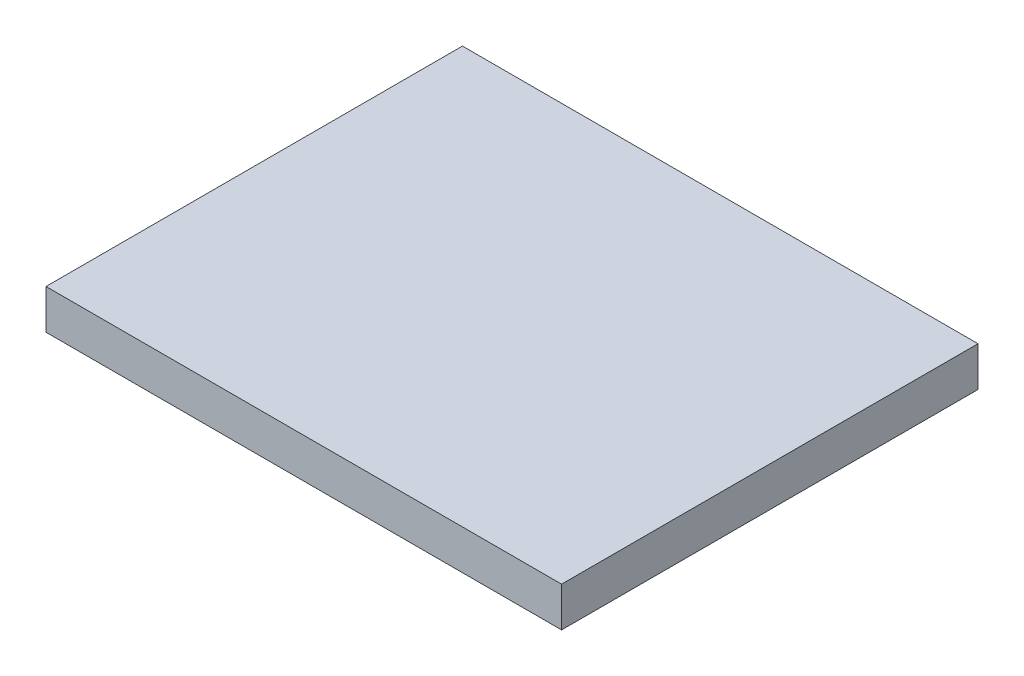
ISO-10303-21;
HEADER;
FILE_DESCRIPTION(('STEP AP214'),'2;1');
FILE_NAME('part.step','',(''),(''),'','','');
FILE_SCHEMA(('AUTOMOTIVE_DESIGN { 1 0 10303 214 1 1 1 1 }'));
ENDSEC;
DATA;
#1=APPLICATION_CONTEXT('core data for automotive mechanical design processes');
#2=APPLICATION_PROTOCOL_DEFINITION('international standard','automotive_design',2000,#1);
#3=PRODUCT_CONTEXT('',#1,'mechanical');
#4=PRODUCT('Part','Part','',(#3));
#5=PRODUCT_RELATED_PRODUCT_CATEGORY('part','',(#4));
#6=PRODUCT_DEFINITION_FORMATION('','',#4);
#7=PRODUCT_DEFINITION_CONTEXT('part definition',#1,'design');
#8=PRODUCT_DEFINITION('design','',#6,#7);
#9=PRODUCT_DEFINITION_SHAPE('','',#8);
#10=(LENGTH_UNIT() NAMED_UNIT(*) SI_UNIT(.MILLI.,.METRE.));
#11=(NAMED_UNIT(*) PLANE_ANGLE_UNIT() SI_UNIT($,.RADIAN.));
#12=(NAMED_UNIT(*) SI_UNIT($,.STERADIAN.) SOLID_ANGLE_UNIT());
#13=UNCERTAINTY_MEASURE_WITH_UNIT(LENGTH_MEASURE(1.E-05),#10,'distance_accuracy_value','');
#14=(GEOMETRIC_REPRESENTATION_CONTEXT(3) GLOBAL_UNCERTAINTY_ASSIGNED_CONTEXT((#13)) GLOBAL_UNIT_ASSIGNED_CONTEXT((#10,
#11,#12)) REPRESENTATION_CONTEXT('',''));
#15=CARTESIAN_POINT('',(0.,0.,0.));
#16=DIRECTION('',(0.,0.,1.));
#17=DIRECTION('',(1.,0.,0.));
#18=AXIS2_PLACEMENT_3D('',#15,#16,#17);
#19=CARTESIAN_POINT('',(-650.,100.,-525.));
#20=DIRECTION('',(1.,0.,0.));
#21=DIRECTION('',(0.,0.,-1.));
#22=AXIS2_PLACEMENT_3D('',#19,#20,#21);
#23=PLANE('',#22);
#24=DIRECTION('',(0.,0.,1.));
#25=VECTOR('',#24,1.);
#26=CARTESIAN_POINT('',(-650.,0.,-525.));
#27=LINE('',#26,#25);
#28=CARTESIAN_POINT('',(-650.,0.,-525.));
#29=VERTEX_POINT('',#28);
#30=CARTESIAN_POINT('',(-650.,0.,525.));
#31=VERTEX_POINT('',#30);
#32=EDGE_CURVE('E96',#29,#31,#27,.T.);
#33=ORIENTED_EDGE('',*,*,#32,.T.);
#34=DIRECTION('',(0.,-1.,0.));
#35=VECTOR('',#34,1.);
#36=CARTESIAN_POINT('',(-650.,100.,525.));
#37=LINE('',#36,#35);
#38=CARTESIAN_POINT('',(-650.,100.,525.));
#39=VERTEX_POINT('',#38);
#40=EDGE_CURVE('E11',#39,#31,#37,.T.);
#41=ORIENTED_EDGE('',*,*,#40,.F.);
#42=DIRECTION('',(0.,0.,1.));
#43=VECTOR('',#42,1.);
#44=CARTESIAN_POINT('',(-650.,100.,-525.));
#45=LINE('',#44,#43);
#46=CARTESIAN_POINT('',(-650.,100.,-525.));
#47=VERTEX_POINT('',#46);
#48=EDGE_CURVE('E84',#47,#39,#45,.T.);
#49=ORIENTED_EDGE('',*,*,#48,.F.);
#50=DIRECTION('',(0.,-1.,0.));
#51=VECTOR('',#50,1.);
#52=CARTESIAN_POINT('',(-650.,100.,-525.));
#53=LINE('',#52,#51);
#54=EDGE_CURVE('E92',#47,#29,#53,.T.);
#55=ORIENTED_EDGE('',*,*,#54,.T.);
#56=EDGE_LOOP('',(#33,#41,#49,#55));
#57=FACE_BOUND('',#56,.T.);
#58=ADVANCED_FACE('F33',(#57),#23,.F.);
#59=CARTESIAN_POINT('',(650.,100.,525.));
#60=DIRECTION('',(0.,0.,-1.));
#61=DIRECTION('',(-1.,0.,0.));
#62=AXIS2_PLACEMENT_3D('',#59,#60,#61);
#63=PLANE('',#62);
#64=DIRECTION('',(1.,0.,0.));
#65=VECTOR('',#64,1.);
#66=CARTESIAN_POINT('',(650.,0.,525.));
#67=LINE('',#66,#65);
#68=CARTESIAN_POINT('',(650.,0.,525.));
#69=VERTEX_POINT('',#68);
#70=EDGE_CURVE('E88',#31,#69,#67,.T.);
#71=ORIENTED_EDGE('',*,*,#70,.T.);
#72=DIRECTION('',(0.,-1.,0.));
#73=VECTOR('',#72,1.);
#74=CARTESIAN_POINT('',(650.,100.,525.));
#75=LINE('',#74,#73);
#76=CARTESIAN_POINT('',(650.,100.,525.));
#77=VERTEX_POINT('',#76);
#78=EDGE_CURVE('E41',#77,#69,#75,.T.);
#79=ORIENTED_EDGE('',*,*,#78,.F.);
#80=DIRECTION('',(1.,0.,0.));
#81=VECTOR('',#80,1.);
#82=CARTESIAN_POINT('',(650.,100.,525.));
#83=LINE('',#82,#81);
#84=EDGE_CURVE('E79',#39,#77,#83,.T.);
#85=ORIENTED_EDGE('',*,*,#84,.F.);
#86=ORIENTED_EDGE('',*,*,#40,.T.);
#87=EDGE_LOOP('',(#71,#79,#85,#86));
#88=FACE_BOUND('',#87,.T.);
#89=ADVANCED_FACE('F87',(#88),#63,.F.);
#90=CARTESIAN_POINT('',(650.,100.,-525.));
#91=DIRECTION('',(-1.,0.,0.));
#92=DIRECTION('',(0.,0.,1.));
#93=AXIS2_PLACEMENT_3D('',#90,#91,#92);
#94=PLANE('',#93);
#95=DIRECTION('',(0.,0.,-1.));
#96=VECTOR('',#95,1.);
#97=CARTESIAN_POINT('',(650.,0.,-525.));
#98=LINE('',#97,#96);
#99=CARTESIAN_POINT('',(650.,0.,-525.));
#100=VERTEX_POINT('',#99);
#101=EDGE_CURVE('E66',#69,#100,#98,.T.);
#102=ORIENTED_EDGE('',*,*,#101,.T.);
#103=DIRECTION('',(0.,-1.,0.));
#104=VECTOR('',#103,1.);
#105=CARTESIAN_POINT('',(650.,100.,-525.));
#106=LINE('',#105,#104);
#107=CARTESIAN_POINT('',(650.,100.,-525.));
#108=VERTEX_POINT('',#107);
#109=EDGE_CURVE('E89',#108,#100,#106,.T.);
#110=ORIENTED_EDGE('',*,*,#109,.F.);
#111=DIRECTION('',(0.,0.,-1.));
#112=VECTOR('',#111,1.);
#113=CARTESIAN_POINT('',(650.,100.,-525.));
#114=LINE('',#113,#112);
#115=EDGE_CURVE('E82',#77,#108,#114,.T.);
#116=ORIENTED_EDGE('',*,*,#115,.F.);
#117=ORIENTED_EDGE('',*,*,#78,.T.);
#118=EDGE_LOOP('',(#102,#110,#116,#117));
#119=FACE_BOUND('',#118,.T.);
#120=ADVANCED_FACE('F90',(#119),#94,.F.);
#121=CARTESIAN_POINT('',(650.,100.,-525.));
#122=DIRECTION('',(0.,0.,1.));
#123=DIRECTION('',(1.,0.,0.));
#124=AXIS2_PLACEMENT_3D('',#121,#122,#123);
#125=PLANE('',#124);
#126=DIRECTION('',(-1.,0.,0.));
#127=VECTOR('',#126,1.);
#128=CARTESIAN_POINT('',(650.,0.,-525.));
#129=LINE('',#128,#127);
#130=EDGE_CURVE('E72',#100,#29,#129,.T.);
#131=ORIENTED_EDGE('',*,*,#130,.T.);
#132=ORIENTED_EDGE('',*,*,#54,.F.);
#133=DIRECTION('',(-1.,0.,0.));
#134=VECTOR('',#133,1.);
#135=CARTESIAN_POINT('',(650.,100.,-525.));
#136=LINE('',#135,#134);
#137=EDGE_CURVE('E49',#108,#47,#136,.T.);
#138=ORIENTED_EDGE('',*,*,#137,.F.);
#139=ORIENTED_EDGE('',*,*,#109,.T.);
#140=EDGE_LOOP('',(#131,#132,#138,#139));
#141=FACE_BOUND('',#140,.T.);
#142=ADVANCED_FACE('F103',(#141),#125,.F.);
#143=CARTESIAN_POINT('',(0.,100.,0.));
#144=DIRECTION('',(0.,-1.,0.));
#145=DIRECTION('',(0.,0.,-1.));
#146=AXIS2_PLACEMENT_3D('',#143,#144,#145);
#147=PLANE('',#146);
#148=ORIENTED_EDGE('',*,*,#48,.T.);
#149=ORIENTED_EDGE('',*,*,#84,.T.);
#150=ORIENTED_EDGE('',*,*,#115,.T.);
#151=ORIENTED_EDGE('',*,*,#137,.T.);
#152=EDGE_LOOP('',(#148,#149,#150,#151));
#153=FACE_BOUND('',#152,.T.);
#154=ADVANCED_FACE('F80',(#153),#147,.F.);
#155=CARTESIAN_POINT('',(0.,0.,0.));
#156=DIRECTION('',(0.,-1.,0.));
#157=DIRECTION('',(0.,0.,-1.));
#158=AXIS2_PLACEMENT_3D('',#155,#156,#157);
#159=PLANE('',#158);
#160=ORIENTED_EDGE('',*,*,#32,.F.);
#161=ORIENTED_EDGE('',*,*,#130,.F.);
#162=ORIENTED_EDGE('',*,*,#101,.F.);
#163=ORIENTED_EDGE('',*,*,#70,.F.);
#164=EDGE_LOOP('',(#160,#161,#162,#163));
#165=FACE_BOUND('',#164,.T.);
#166=ADVANCED_FACE('F106',(#165),#159,.T.);
#167=CLOSED_SHELL('',(#58,#89,#120,#142,#154,#166));
#168=MANIFOLD_SOLID_BREP('B2',#167);
#169=ADVANCED_BREP_SHAPE_REPRESENTATION('',(#18,#168),#14);
#170=SHAPE_DEFINITION_REPRESENTATION(#9,#169);
ENDSEC;
END-ISO-10303-21;
